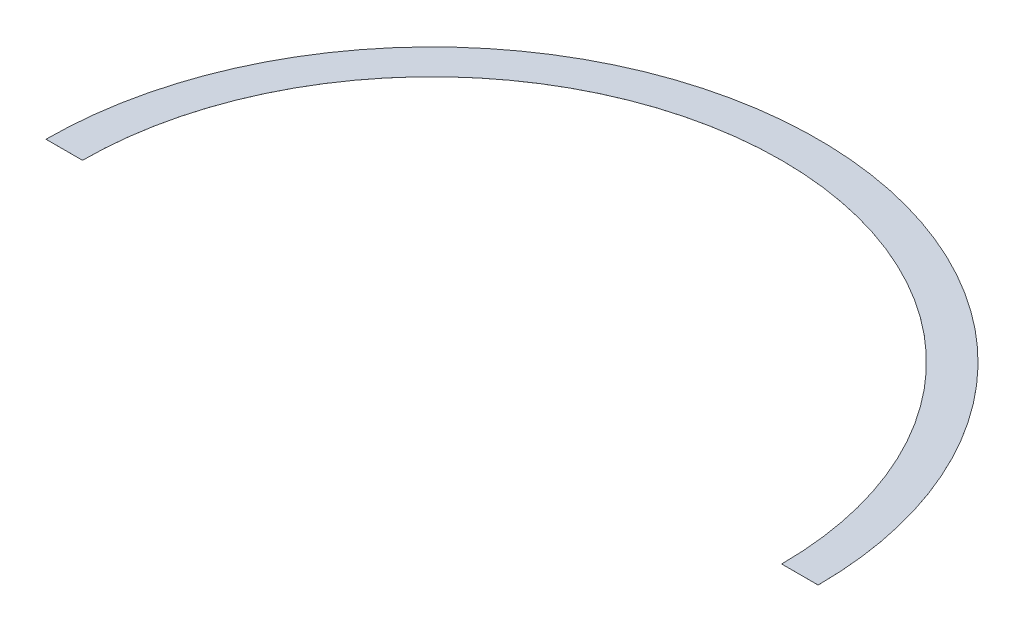
ISO-10303-21;
HEADER;
FILE_DESCRIPTION(('STEP AP214'),'2;1');
FILE_NAME('part.step','',(''),(''),'','','');
FILE_SCHEMA(('AUTOMOTIVE_DESIGN { 1 0 10303 214 1 1 1 1 }'));
ENDSEC;
DATA;
#1=APPLICATION_CONTEXT('core data for automotive mechanical design processes');
#2=APPLICATION_PROTOCOL_DEFINITION('international standard','automotive_design',2000,#1);
#3=PRODUCT_CONTEXT('',#1,'mechanical');
#4=PRODUCT('Part','Part','',(#3));
#5=PRODUCT_RELATED_PRODUCT_CATEGORY('part','',(#4));
#6=PRODUCT_DEFINITION_FORMATION('','',#4);
#7=PRODUCT_DEFINITION_CONTEXT('part definition',#1,'design');
#8=PRODUCT_DEFINITION('design','',#6,#7);
#9=PRODUCT_DEFINITION_SHAPE('','',#8);
#10=(LENGTH_UNIT() NAMED_UNIT(*) SI_UNIT(.MILLI.,.METRE.));
#11=(NAMED_UNIT(*) PLANE_ANGLE_UNIT() SI_UNIT($,.RADIAN.));
#12=(NAMED_UNIT(*) SI_UNIT($,.STERADIAN.) SOLID_ANGLE_UNIT());
#13=UNCERTAINTY_MEASURE_WITH_UNIT(LENGTH_MEASURE(1.E-05),#10,'distance_accuracy_value','');
#14=(GEOMETRIC_REPRESENTATION_CONTEXT(3) GLOBAL_UNCERTAINTY_ASSIGNED_CONTEXT((#13)) GLOBAL_UNIT_ASSIGNED_CONTEXT((#10,
#11,#12)) REPRESENTATION_CONTEXT('',''));
#15=CARTESIAN_POINT('',(0.,0.,0.));
#16=DIRECTION('',(0.,0.,1.));
#17=DIRECTION('',(1.,0.,0.));
#18=AXIS2_PLACEMENT_3D('',#15,#16,#17);
#19=CARTESIAN_POINT('',(279.147838680577,0.01,-1030.29584073706));
#20=DIRECTION('',(0.,0.,-1.));
#21=DIRECTION('',(-1.,0.,0.));
#22=AXIS2_PLACEMENT_3D('',#19,#20,#21);
#23=PLANE('',#22);
#24=DIRECTION('',(1.,0.,0.));
#25=VECTOR('',#24,1.);
#26=CARTESIAN_POINT('',(279.147838680577,0.,-1030.29584073706));
#27=LINE('',#26,#25);
#28=CARTESIAN_POINT('',(279.147838680578,0.,-1030.29584073706));
#29=VERTEX_POINT('',#28);
#30=CARTESIAN_POINT('',(298.082229914933,0.,-1030.29584073706));
#31=VERTEX_POINT('',#30);
#32=EDGE_CURVE('E107',#29,#31,#27,.T.);
#33=ORIENTED_EDGE('',*,*,#32,.T.);
#34=DIRECTION('',(0.,-1.,0.));
#35=VECTOR('',#34,1.);
#36=CARTESIAN_POINT('',(298.082229914933,0.01,-1030.29584073706));
#37=LINE('',#36,#35);
#38=CARTESIAN_POINT('',(298.082229914933,0.01,-1030.29584073706));
#39=VERTEX_POINT('',#38);
#40=EDGE_CURVE('E11',#39,#31,#37,.T.);
#41=ORIENTED_EDGE('',*,*,#40,.F.);
#42=DIRECTION('',(1.,0.,0.));
#43=VECTOR('',#42,1.);
#44=CARTESIAN_POINT('',(279.147838680577,0.01,-1030.29584073706));
#45=LINE('',#44,#43);
#46=CARTESIAN_POINT('',(279.147838680578,0.01,-1030.29584073706));
#47=VERTEX_POINT('',#46);
#48=EDGE_CURVE('E89',#47,#39,#45,.T.);
#49=ORIENTED_EDGE('',*,*,#48,.F.);
#50=DIRECTION('',(0.,-1.,0.));
#51=VECTOR('',#50,1.);
#52=CARTESIAN_POINT('',(279.147838680578,0.01,-1030.29584073706));
#53=LINE('',#52,#51);
#54=EDGE_CURVE('E56',#47,#29,#53,.T.);
#55=ORIENTED_EDGE('',*,*,#54,.T.);
#56=EDGE_LOOP('',(#33,#41,#49,#55));
#57=FACE_BOUND('',#56,.T.);
#58=ADVANCED_FACE('F39',(#57),#23,.F.);
#59=CARTESIAN_POINT('',(479.463444362144,0.01,-1030.29584073706));
#60=DIRECTION('',(0.,-1.,0.));
#61=DIRECTION('',(0.,0.,-1.));
#62=AXIS2_PLACEMENT_3D('',#59,#60,#61);
#63=CYLINDRICAL_SURFACE('',#62,181.381214447211);
#64=CARTESIAN_POINT('',(479.463444362144,0.,-1030.29584073706));
#65=DIRECTION('',(0.,-1.,0.));
#66=DIRECTION('',(0.,0.,-1.));
#67=AXIS2_PLACEMENT_3D('',#64,#65,#66);
#68=CIRCLE('',#67,181.381214447211);
#69=CARTESIAN_POINT('',(660.844658809355,0.,-1030.29584073706));
#70=VERTEX_POINT('',#69);
#71=EDGE_CURVE('E95',#31,#70,#68,.T.);
#72=ORIENTED_EDGE('',*,*,#71,.T.);
#73=DIRECTION('',(0.,-1.,0.));
#74=VECTOR('',#73,1.);
#75=CARTESIAN_POINT('',(660.844658809355,0.01,-1030.29584073706));
#76=LINE('',#75,#74);
#77=CARTESIAN_POINT('',(660.844658809355,0.01,-1030.29584073706));
#78=VERTEX_POINT('',#77);
#79=EDGE_CURVE('E48',#78,#70,#76,.T.);
#80=ORIENTED_EDGE('',*,*,#79,.F.);
#81=CARTESIAN_POINT('',(479.463444362144,0.01,-1030.29584073706));
#82=DIRECTION('',(0.,-1.,0.));
#83=DIRECTION('',(0.,0.,-1.));
#84=AXIS2_PLACEMENT_3D('',#81,#82,#83);
#85=CIRCLE('',#84,181.381214447211);
#86=EDGE_CURVE('E82',#39,#78,#85,.T.);
#87=ORIENTED_EDGE('',*,*,#86,.F.);
#88=ORIENTED_EDGE('',*,*,#40,.T.);
#89=EDGE_LOOP('',(#72,#80,#87,#88));
#90=FACE_BOUND('',#89,.T.);
#91=ADVANCED_FACE('F94',(#90),#63,.F.);
#92=CARTESIAN_POINT('',(660.844658809355,0.01,-1030.29584073706));
#93=DIRECTION('',(0.,0.,-1.));
#94=DIRECTION('',(-1.,0.,0.));
#95=AXIS2_PLACEMENT_3D('',#92,#93,#94);
#96=PLANE('',#95);
#97=DIRECTION('',(1.,0.,0.));
#98=VECTOR('',#97,1.);
#99=CARTESIAN_POINT('',(660.844658809355,0.,-1030.29584073706));
#100=LINE('',#99,#98);
#101=CARTESIAN_POINT('',(679.779050052044,0.,-1030.29584073706));
#102=VERTEX_POINT('',#101);
#103=EDGE_CURVE('E112',#70,#102,#100,.T.);
#104=ORIENTED_EDGE('',*,*,#103,.T.);
#105=DIRECTION('',(0.,-1.,0.));
#106=VECTOR('',#105,1.);
#107=CARTESIAN_POINT('',(679.779050052044,0.01,-1030.29584073706));
#108=LINE('',#107,#106);
#109=CARTESIAN_POINT('',(679.779050052044,0.01,-1030.29584073706));
#110=VERTEX_POINT('',#109);
#111=EDGE_CURVE('E71',#110,#102,#108,.T.);
#112=ORIENTED_EDGE('',*,*,#111,.F.);
#113=DIRECTION('',(1.,0.,0.));
#114=VECTOR('',#113,1.);
#115=CARTESIAN_POINT('',(660.844658809355,0.01,-1030.29584073706));
#116=LINE('',#115,#114);
#117=EDGE_CURVE('E88',#78,#110,#116,.T.);
#118=ORIENTED_EDGE('',*,*,#117,.F.);
#119=ORIENTED_EDGE('',*,*,#79,.T.);
#120=EDGE_LOOP('',(#104,#112,#118,#119));
#121=FACE_BOUND('',#120,.T.);
#122=ADVANCED_FACE('F99',(#121),#96,.F.);
#123=CARTESIAN_POINT('',(479.463444366311,0.01,-1030.29584073706));
#124=DIRECTION('',(0.,-1.,0.));
#125=DIRECTION('',(0.,0.,-1.));
#126=AXIS2_PLACEMENT_3D('',#123,#124,#125);
#127=CYLINDRICAL_SURFACE('',#126,200.315605685733);
#128=CARTESIAN_POINT('',(479.463444366311,0.,-1030.29584073706));
#129=DIRECTION('',(0.,-1.,0.));
#130=DIRECTION('',(0.,0.,-1.));
#131=AXIS2_PLACEMENT_3D('',#128,#129,#130);
#132=CIRCLE('',#131,200.315605685733);
#133=EDGE_CURVE('E115',#29,#102,#132,.T.);
#134=ORIENTED_EDGE('',*,*,#133,.F.);
#135=ORIENTED_EDGE('',*,*,#54,.F.);
#136=CARTESIAN_POINT('',(479.463444366311,0.01,-1030.29584073706));
#137=DIRECTION('',(0.,-1.,0.));
#138=DIRECTION('',(0.,0.,-1.));
#139=AXIS2_PLACEMENT_3D('',#136,#137,#138);
#140=CIRCLE('',#139,200.315605685733);
#141=EDGE_CURVE('E101',#47,#110,#140,.T.);
#142=ORIENTED_EDGE('',*,*,#141,.T.);
#143=ORIENTED_EDGE('',*,*,#111,.T.);
#144=EDGE_LOOP('',(#134,#135,#142,#143));
#145=FACE_BOUND('',#144,.T.);
#146=ADVANCED_FACE('F125',(#145),#127,.T.);
#147=CARTESIAN_POINT('',(479.463444362144,0.01,-1030.29584073706));
#148=DIRECTION('',(0.,-1.,0.));
#149=DIRECTION('',(0.,0.,-1.));
#150=AXIS2_PLACEMENT_3D('',#147,#148,#149);
#151=PLANE('',#150);
#152=ORIENTED_EDGE('',*,*,#48,.T.);
#153=ORIENTED_EDGE('',*,*,#86,.T.);
#154=ORIENTED_EDGE('',*,*,#117,.T.);
#155=ORIENTED_EDGE('',*,*,#141,.F.);
#156=EDGE_LOOP('',(#152,#153,#154,#155));
#157=FACE_BOUND('',#156,.T.);
#158=ADVANCED_FACE('F85',(#157),#151,.F.);
#159=CARTESIAN_POINT('',(479.463444362144,0.,-1030.29584073706));
#160=DIRECTION('',(0.,-1.,0.));
#161=DIRECTION('',(0.,0.,-1.));
#162=AXIS2_PLACEMENT_3D('',#159,#160,#161);
#163=PLANE('',#162);
#164=ORIENTED_EDGE('',*,*,#32,.F.);
#165=ORIENTED_EDGE('',*,*,#133,.T.);
#166=ORIENTED_EDGE('',*,*,#103,.F.);
#167=ORIENTED_EDGE('',*,*,#71,.F.);
#168=EDGE_LOOP('',(#164,#165,#166,#167));
#169=FACE_BOUND('',#168,.T.);
#170=ADVANCED_FACE('F124',(#169),#163,.T.);
#171=CLOSED_SHELL('',(#58,#91,#122,#146,#158,#170));
#172=MANIFOLD_SOLID_BREP('B2',#171);
#173=ADVANCED_BREP_SHAPE_REPRESENTATION('',(#18,#172),#14);
#174=SHAPE_DEFINITION_REPRESENTATION(#9,#173);
ENDSEC;
END-ISO-10303-21;
